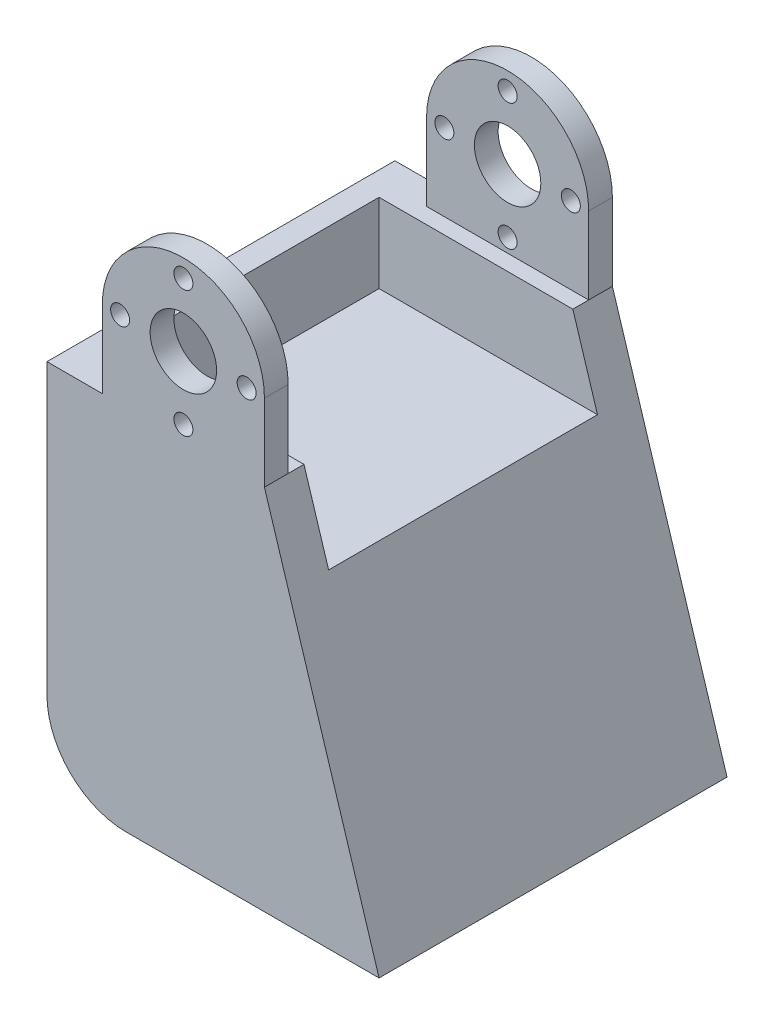
ISO-10303-21;
HEADER;
FILE_DESCRIPTION(('STEP AP214'),'2;1');
FILE_NAME('part.step','',(''),(''),'','','');
FILE_SCHEMA(('AUTOMOTIVE_DESIGN { 1 0 10303 214 1 1 1 1 }'));
ENDSEC;
DATA;
#1=APPLICATION_CONTEXT('core data for automotive mechanical design processes');
#2=APPLICATION_PROTOCOL_DEFINITION('international standard','automotive_design',2000,#1);
#3=PRODUCT_CONTEXT('',#1,'mechanical');
#4=PRODUCT('Part','Part','',(#3));
#5=PRODUCT_RELATED_PRODUCT_CATEGORY('part','',(#4));
#6=PRODUCT_DEFINITION_FORMATION('','',#4);
#7=PRODUCT_DEFINITION_CONTEXT('part definition',#1,'design');
#8=PRODUCT_DEFINITION('design','',#6,#7);
#9=PRODUCT_DEFINITION_SHAPE('','',#8);
#10=(LENGTH_UNIT() NAMED_UNIT(*) SI_UNIT(.MILLI.,.METRE.));
#11=(NAMED_UNIT(*) PLANE_ANGLE_UNIT() SI_UNIT($,.RADIAN.));
#12=(NAMED_UNIT(*) SI_UNIT($,.STERADIAN.) SOLID_ANGLE_UNIT());
#13=UNCERTAINTY_MEASURE_WITH_UNIT(LENGTH_MEASURE(1.E-05),#10,'distance_accuracy_value','');
#14=(GEOMETRIC_REPRESENTATION_CONTEXT(3) GLOBAL_UNCERTAINTY_ASSIGNED_CONTEXT((#13)) GLOBAL_UNIT_ASSIGNED_CONTEXT((#10,
#11,#12)) REPRESENTATION_CONTEXT('',''));
#15=CARTESIAN_POINT('',(0.,0.,0.));
#16=DIRECTION('',(0.,0.,1.));
#17=DIRECTION('',(1.,0.,0.));
#18=AXIS2_PLACEMENT_3D('',#15,#16,#17);
#19=CARTESIAN_POINT('',(10.25,0.,-22.));
#20=DIRECTION('',(-1.,0.,0.));
#21=DIRECTION('',(0.,0.,1.));
#22=AXIS2_PLACEMENT_3D('',#19,#20,#21);
#23=PLANE('',#22);
#24=DIRECTION('',(0.,0.,1.));
#25=VECTOR('',#24,1.);
#26=CARTESIAN_POINT('',(10.25,-9.75,-22.));
#27=LINE('',#26,#25);
#28=CARTESIAN_POINT('',(10.25,-9.75,19.));
#29=VERTEX_POINT('',#28);
#30=CARTESIAN_POINT('',(10.25,-9.75,22.));
#31=VERTEX_POINT('',#30);
#32=EDGE_CURVE('E270',#29,#31,#27,.T.);
#33=ORIENTED_EDGE('',*,*,#32,.F.);
#34=DIRECTION('',(0.,1.,0.));
#35=VECTOR('',#34,1.);
#36=CARTESIAN_POINT('',(10.25,10.25,19.));
#37=LINE('',#36,#35);
#38=CARTESIAN_POINT('',(10.25,0.,19.));
#39=VERTEX_POINT('',#38);
#40=EDGE_CURVE('E316',#29,#39,#37,.T.);
#41=ORIENTED_EDGE('',*,*,#40,.T.);
#42=DIRECTION('',(0.,0.,1.));
#43=VECTOR('',#42,1.);
#44=CARTESIAN_POINT('',(10.25,0.,-22.));
#45=LINE('',#44,#43);
#46=CARTESIAN_POINT('',(10.25,0.,22.));
#47=VERTEX_POINT('',#46);
#48=EDGE_CURVE('E444',#39,#47,#45,.T.);
#49=ORIENTED_EDGE('',*,*,#48,.T.);
#50=DIRECTION('',(0.,-1.,0.));
#51=VECTOR('',#50,1.);
#52=CARTESIAN_POINT('',(10.25,0.,22.));
#53=LINE('',#52,#51);
#54=EDGE_CURVE('E398',#47,#31,#53,.T.);
#55=ORIENTED_EDGE('',*,*,#54,.T.);
#56=EDGE_LOOP('',(#33,#41,#49,#55));
#57=FACE_BOUND('',#56,.T.);
#58=ADVANCED_FACE('F109',(#57),#23,.F.);
#59=CARTESIAN_POINT('',(10.25,-9.75,-22.));
#60=VERTEX_POINT('',#59);
#61=CARTESIAN_POINT('',(10.25,-9.75,-19.));
#62=VERTEX_POINT('',#61);
#63=EDGE_CURVE('E276',#60,#62,#27,.T.);
#64=ORIENTED_EDGE('',*,*,#63,.F.);
#65=DIRECTION('',(0.,-1.,0.));
#66=VECTOR('',#65,1.);
#67=CARTESIAN_POINT('',(10.25,0.,-22.));
#68=LINE('',#67,#66);
#69=CARTESIAN_POINT('',(10.25,0.,-22.));
#70=VERTEX_POINT('',#69);
#71=EDGE_CURVE('E430',#70,#60,#68,.T.);
#72=ORIENTED_EDGE('',*,*,#71,.F.);
#73=CARTESIAN_POINT('',(10.25,0.,-19.));
#74=VERTEX_POINT('',#73);
#75=EDGE_CURVE('E439',#70,#74,#45,.T.);
#76=ORIENTED_EDGE('',*,*,#75,.T.);
#77=DIRECTION('',(0.,-1.,0.));
#78=VECTOR('',#77,1.);
#79=CARTESIAN_POINT('',(10.25,10.25,-19.));
#80=LINE('',#79,#78);
#81=EDGE_CURVE('E312',#74,#62,#80,.T.);
#82=ORIENTED_EDGE('',*,*,#81,.T.);
#83=EDGE_LOOP('',(#64,#72,#76,#82));
#84=FACE_BOUND('',#83,.T.);
#85=ADVANCED_FACE('F552',(#84),#23,.F.);
#86=CARTESIAN_POINT('',(0.,0.,-22.));
#87=DIRECTION('',(0.,0.,1.));
#88=DIRECTION('',(1.,0.,0.));
#89=AXIS2_PLACEMENT_3D('',#86,#87,#88);
#90=PLANE('',#89);
#91=DIRECTION('',(1.,0.,0.));
#92=VECTOR('',#91,1.);
#93=CARTESIAN_POINT('',(0.,-56.25,-22.));
#94=LINE('',#93,#92);
#95=CARTESIAN_POINT('',(-7.25,-56.25,-22.));
#96=VERTEX_POINT('',#95);
#97=CARTESIAN_POINT('',(24.75,-56.25,-22.));
#98=VERTEX_POINT('',#97);
#99=EDGE_CURVE('E285',#96,#98,#94,.T.);
#100=ORIENTED_EDGE('',*,*,#99,.F.);
#101=CARTESIAN_POINT('',(-7.25,-46.25,-22.));
#102=DIRECTION('',(0.,0.,1.));
#103=DIRECTION('',(1.,0.,0.));
#104=AXIS2_PLACEMENT_3D('',#101,#102,#103);
#105=CIRCLE('',#104,10.);
#106=CARTESIAN_POINT('',(-17.25,-46.25,-22.));
#107=VERTEX_POINT('',#106);
#108=EDGE_CURVE('E12',#96,#107,#105,.F.);
#109=ORIENTED_EDGE('',*,*,#108,.T.);
#110=DIRECTION('',(0.,1.,0.));
#111=VECTOR('',#110,1.);
#112=CARTESIAN_POINT('',(-17.25,-75.25,-22.));
#113=LINE('',#112,#111);
#114=CARTESIAN_POINT('',(-17.25,-9.75,-22.));
#115=VERTEX_POINT('',#114);
#116=EDGE_CURVE('E305',#107,#115,#113,.T.);
#117=ORIENTED_EDGE('',*,*,#116,.T.);
#118=DIRECTION('',(-1.,0.,0.));
#119=VECTOR('',#118,1.);
#120=CARTESIAN_POINT('',(-10.25,-9.75,-22.));
#121=LINE('',#120,#119);
#122=CARTESIAN_POINT('',(-10.25,-9.75,-22.));
#123=VERTEX_POINT('',#122);
#124=EDGE_CURVE('E294',#123,#115,#121,.T.);
#125=ORIENTED_EDGE('',*,*,#124,.F.);
#126=DIRECTION('',(0.,-1.,0.));
#127=VECTOR('',#126,1.);
#128=CARTESIAN_POINT('',(-10.25,0.,-22.));
#129=LINE('',#128,#127);
#130=CARTESIAN_POINT('',(-10.25,0.,-22.));
#131=VERTEX_POINT('',#130);
#132=EDGE_CURVE('E426',#131,#123,#129,.T.);
#133=ORIENTED_EDGE('',*,*,#132,.F.);
#134=CARTESIAN_POINT('',(0.,0.,-22.));
#135=DIRECTION('',(0.,0.,1.));
#136=DIRECTION('',(1.,0.,0.));
#137=AXIS2_PLACEMENT_3D('',#134,#135,#136);
#138=CIRCLE('',#137,10.25);
#139=EDGE_CURVE('E422',#70,#131,#138,.T.);
#140=ORIENTED_EDGE('',*,*,#139,.F.);
#141=ORIENTED_EDGE('',*,*,#71,.T.);
#142=DIRECTION('',(0.297690442538056,-0.954662453656525,0.));
#143=VECTOR('',#142,1.);
#144=CARTESIAN_POINT('',(6.57075869336143,2.04894625922023,-22.));
#145=LINE('',#144,#143);
#146=EDGE_CURVE('E266',#60,#98,#145,.T.);
#147=ORIENTED_EDGE('',*,*,#146,.T.);
#148=EDGE_LOOP('',(#100,#109,#117,#125,#133,#140,#141,#147));
#149=FACE_BOUND('',#148,.T.);
#150=CARTESIAN_POINT('',(0.,-8.,-22.));
#151=DIRECTION('',(0.,0.,1.));
#152=DIRECTION('',(1.,0.,0.));
#153=AXIS2_PLACEMENT_3D('',#150,#151,#152);
#154=CIRCLE('',#153,1.2);
#155=CARTESIAN_POINT('',(1.19999999999994,-8.,-22.));
#156=VERTEX_POINT('',#155);
#157=EDGE_CURVE('E434',#156,#156,#154,.T.);
#158=ORIENTED_EDGE('',*,*,#157,.T.);
#159=EDGE_LOOP('',(#158));
#160=FACE_BOUND('',#159,.T.);
#161=CARTESIAN_POINT('',(0.,0.,-22.));
#162=DIRECTION('',(0.,0.,1.));
#163=DIRECTION('',(1.,0.,0.));
#164=AXIS2_PLACEMENT_3D('',#161,#162,#163);
#165=CIRCLE('',#164,4.2);
#166=CARTESIAN_POINT('',(4.2,0.,-22.));
#167=VERTEX_POINT('',#166);
#168=EDGE_CURVE('E418',#167,#167,#165,.T.);
#169=ORIENTED_EDGE('',*,*,#168,.T.);
#170=EDGE_LOOP('',(#169));
#171=FACE_BOUND('',#170,.T.);
#172=CARTESIAN_POINT('',(8.,0.,-22.));
#173=DIRECTION('',(0.,0.,1.));
#174=DIRECTION('',(1.,0.,0.));
#175=AXIS2_PLACEMENT_3D('',#172,#173,#174);
#176=CIRCLE('',#175,1.2);
#177=CARTESIAN_POINT('',(9.2,0.,-22.));
#178=VERTEX_POINT('',#177);
#179=EDGE_CURVE('E414',#178,#178,#176,.T.);
#180=ORIENTED_EDGE('',*,*,#179,.T.);
#181=EDGE_LOOP('',(#180));
#182=FACE_BOUND('',#181,.T.);
#183=CARTESIAN_POINT('',(0.,8.,-22.));
#184=DIRECTION('',(0.,0.,1.));
#185=DIRECTION('',(1.,0.,0.));
#186=AXIS2_PLACEMENT_3D('',#183,#184,#185);
#187=CIRCLE('',#186,1.2);
#188=CARTESIAN_POINT('',(1.2,8.,-22.));
#189=VERTEX_POINT('',#188);
#190=EDGE_CURVE('E410',#189,#189,#187,.T.);
#191=ORIENTED_EDGE('',*,*,#190,.T.);
#192=EDGE_LOOP('',(#191));
#193=FACE_BOUND('',#192,.T.);
#194=CARTESIAN_POINT('',(-8.,0.,-22.));
#195=DIRECTION('',(0.,0.,1.));
#196=DIRECTION('',(1.,0.,0.));
#197=AXIS2_PLACEMENT_3D('',#194,#195,#196);
#198=CIRCLE('',#197,1.2);
#199=CARTESIAN_POINT('',(-6.8,0.,-22.));
#200=VERTEX_POINT('',#199);
#201=EDGE_CURVE('E406',#200,#200,#198,.T.);
#202=ORIENTED_EDGE('',*,*,#201,.T.);
#203=EDGE_LOOP('',(#202));
#204=FACE_BOUND('',#203,.T.);
#205=ADVANCED_FACE('F527',(#149,#160,#171,#182,#193,#204),#90,.F.);
#206=CARTESIAN_POINT('',(0.,0.,22.));
#207=DIRECTION('',(0.,0.,1.));
#208=DIRECTION('',(1.,0.,0.));
#209=AXIS2_PLACEMENT_3D('',#206,#207,#208);
#210=PLANE('',#209);
#211=DIRECTION('',(0.,1.,0.));
#212=VECTOR('',#211,1.);
#213=CARTESIAN_POINT('',(-17.25,-75.25,22.));
#214=LINE('',#213,#212);
#215=CARTESIAN_POINT('',(-17.25,-46.25,22.));
#216=VERTEX_POINT('',#215);
#217=CARTESIAN_POINT('',(-17.25,-9.75,22.));
#218=VERTEX_POINT('',#217);
#219=EDGE_CURVE('E306',#216,#218,#214,.T.);
#220=ORIENTED_EDGE('',*,*,#219,.F.);
#221=CARTESIAN_POINT('',(-7.24999999999999,-46.25,22.));
#222=DIRECTION('',(0.,0.,1.));
#223=DIRECTION('',(1.,0.,0.));
#224=AXIS2_PLACEMENT_3D('',#221,#222,#223);
#225=CIRCLE('',#224,10.);
#226=CARTESIAN_POINT('',(-7.24999999999999,-56.25,22.));
#227=VERTEX_POINT('',#226);
#228=EDGE_CURVE('E132',#216,#227,#225,.T.);
#229=ORIENTED_EDGE('',*,*,#228,.T.);
#230=DIRECTION('',(1.,0.,0.));
#231=VECTOR('',#230,1.);
#232=CARTESIAN_POINT('',(0.,-56.25,22.));
#233=LINE('',#232,#231);
#234=CARTESIAN_POINT('',(24.75,-56.25,22.));
#235=VERTEX_POINT('',#234);
#236=EDGE_CURVE('E284',#227,#235,#233,.T.);
#237=ORIENTED_EDGE('',*,*,#236,.T.);
#238=DIRECTION('',(0.297690442538056,-0.954662453656525,0.));
#239=VECTOR('',#238,1.);
#240=CARTESIAN_POINT('',(6.57075869336143,2.04894625922023,22.));
#241=LINE('',#240,#239);
#242=EDGE_CURVE('E261',#31,#235,#241,.T.);
#243=ORIENTED_EDGE('',*,*,#242,.F.);
#244=ORIENTED_EDGE('',*,*,#54,.F.);
#245=CARTESIAN_POINT('',(0.,0.,22.));
#246=DIRECTION('',(0.,0.,1.));
#247=DIRECTION('',(1.,0.,0.));
#248=AXIS2_PLACEMENT_3D('',#245,#246,#247);
#249=CIRCLE('',#248,10.25);
#250=CARTESIAN_POINT('',(-10.25,0.,22.));
#251=VERTEX_POINT('',#250);
#252=EDGE_CURVE('E390',#47,#251,#249,.T.);
#253=ORIENTED_EDGE('',*,*,#252,.T.);
#254=DIRECTION('',(0.,-1.,0.));
#255=VECTOR('',#254,1.);
#256=CARTESIAN_POINT('',(-10.25,0.,22.));
#257=LINE('',#256,#255);
#258=CARTESIAN_POINT('',(-10.25,-9.75,22.));
#259=VERTEX_POINT('',#258);
#260=EDGE_CURVE('E394',#251,#259,#257,.T.);
#261=ORIENTED_EDGE('',*,*,#260,.T.);
#262=DIRECTION('',(1.,0.,0.));
#263=VECTOR('',#262,1.);
#264=CARTESIAN_POINT('',(-10.25,-9.75,22.));
#265=LINE('',#264,#263);
#266=EDGE_CURVE('E302',#218,#259,#265,.T.);
#267=ORIENTED_EDGE('',*,*,#266,.F.);
#268=EDGE_LOOP('',(#220,#229,#237,#243,#244,#253,#261,#267));
#269=FACE_BOUND('',#268,.T.);
#270=CARTESIAN_POINT('',(-8.,0.,22.));
#271=DIRECTION('',(0.,0.,1.));
#272=DIRECTION('',(1.,0.,0.));
#273=AXIS2_PLACEMENT_3D('',#270,#271,#272);
#274=CIRCLE('',#273,1.2);
#275=CARTESIAN_POINT('',(-6.8,0.,22.));
#276=VERTEX_POINT('',#275);
#277=EDGE_CURVE('E374',#276,#276,#274,.T.);
#278=ORIENTED_EDGE('',*,*,#277,.F.);
#279=EDGE_LOOP('',(#278));
#280=FACE_BOUND('',#279,.T.);
#281=CARTESIAN_POINT('',(0.,8.,22.));
#282=DIRECTION('',(0.,0.,1.));
#283=DIRECTION('',(1.,0.,0.));
#284=AXIS2_PLACEMENT_3D('',#281,#282,#283);
#285=CIRCLE('',#284,1.2);
#286=CARTESIAN_POINT('',(1.2,8.,22.));
#287=VERTEX_POINT('',#286);
#288=EDGE_CURVE('E378',#287,#287,#285,.T.);
#289=ORIENTED_EDGE('',*,*,#288,.F.);
#290=EDGE_LOOP('',(#289));
#291=FACE_BOUND('',#290,.T.);
#292=CARTESIAN_POINT('',(8.,0.,22.));
#293=DIRECTION('',(0.,0.,1.));
#294=DIRECTION('',(1.,0.,0.));
#295=AXIS2_PLACEMENT_3D('',#292,#293,#294);
#296=CIRCLE('',#295,1.2);
#297=CARTESIAN_POINT('',(9.2,0.,22.));
#298=VERTEX_POINT('',#297);
#299=EDGE_CURVE('E382',#298,#298,#296,.T.);
#300=ORIENTED_EDGE('',*,*,#299,.F.);
#301=EDGE_LOOP('',(#300));
#302=FACE_BOUND('',#301,.T.);
#303=CARTESIAN_POINT('',(0.,0.,22.));
#304=DIRECTION('',(0.,0.,1.));
#305=DIRECTION('',(1.,0.,0.));
#306=AXIS2_PLACEMENT_3D('',#303,#304,#305);
#307=CIRCLE('',#306,4.2);
#308=CARTESIAN_POINT('',(4.2,0.,22.));
#309=VERTEX_POINT('',#308);
#310=EDGE_CURVE('E386',#309,#309,#307,.T.);
#311=ORIENTED_EDGE('',*,*,#310,.F.);
#312=EDGE_LOOP('',(#311));
#313=FACE_BOUND('',#312,.T.);
#314=CARTESIAN_POINT('',(0.,-8.,22.));
#315=DIRECTION('',(0.,0.,1.));
#316=DIRECTION('',(1.,0.,0.));
#317=AXIS2_PLACEMENT_3D('',#314,#315,#316);
#318=CIRCLE('',#317,1.2);
#319=CARTESIAN_POINT('',(1.19999999999994,-8.,22.));
#320=VERTEX_POINT('',#319);
#321=EDGE_CURVE('E402',#320,#320,#318,.T.);
#322=ORIENTED_EDGE('',*,*,#321,.F.);
#323=EDGE_LOOP('',(#322));
#324=FACE_BOUND('',#323,.T.);
#325=ADVANCED_FACE('F483',(#269,#280,#291,#302,#313,#324),#210,.T.);
#326=CARTESIAN_POINT('',(-17.25,-75.25,-22.));
#327=DIRECTION('',(-1.,0.,0.));
#328=DIRECTION('',(0.,0.,1.));
#329=AXIS2_PLACEMENT_3D('',#326,#327,#328);
#330=PLANE('',#329);
#331=ORIENTED_EDGE('',*,*,#116,.F.);
#332=DIRECTION('',(0.,0.,1.));
#333=VECTOR('',#332,1.);
#334=CARTESIAN_POINT('',(-17.25,-46.25,-22.));
#335=LINE('',#334,#333);
#336=EDGE_CURVE('E463',#107,#216,#335,.T.);
#337=ORIENTED_EDGE('',*,*,#336,.T.);
#338=ORIENTED_EDGE('',*,*,#219,.T.);
#339=DIRECTION('',(0.,0.,1.));
#340=VECTOR('',#339,1.);
#341=CARTESIAN_POINT('',(-17.25,-9.75,-22.));
#342=LINE('',#341,#340);
#343=EDGE_CURVE('E298',#115,#218,#342,.T.);
#344=ORIENTED_EDGE('',*,*,#343,.F.);
#345=EDGE_LOOP('',(#331,#337,#338,#344));
#346=FACE_BOUND('',#345,.T.);
#347=ADVANCED_FACE('F526',(#346),#330,.T.);
#348=CARTESIAN_POINT('',(-10.25,0.,-22.));
#349=DIRECTION('',(-1.,0.,0.));
#350=DIRECTION('',(0.,0.,1.));
#351=AXIS2_PLACEMENT_3D('',#348,#349,#350);
#352=PLANE('',#351);
#353=ORIENTED_EDGE('',*,*,#132,.T.);
#354=DIRECTION('',(0.,0.,-1.));
#355=VECTOR('',#354,1.);
#356=CARTESIAN_POINT('',(-10.25,-9.75,-22.));
#357=LINE('',#356,#355);
#358=CARTESIAN_POINT('',(-10.25,-9.75,-19.));
#359=VERTEX_POINT('',#358);
#360=EDGE_CURVE('E288',#359,#123,#357,.T.);
#361=ORIENTED_EDGE('',*,*,#360,.F.);
#362=DIRECTION('',(0.,-1.,0.));
#363=VECTOR('',#362,1.);
#364=CARTESIAN_POINT('',(-10.25,10.25,-19.));
#365=LINE('',#364,#363);
#366=CARTESIAN_POINT('',(-10.25,0.,-19.));
#367=VERTEX_POINT('',#366);
#368=EDGE_CURVE('E309',#367,#359,#365,.T.);
#369=ORIENTED_EDGE('',*,*,#368,.F.);
#370=DIRECTION('',(0.,0.,1.));
#371=VECTOR('',#370,1.);
#372=CARTESIAN_POINT('',(-10.25,0.,-22.));
#373=LINE('',#372,#371);
#374=EDGE_CURVE('E445',#131,#367,#373,.T.);
#375=ORIENTED_EDGE('',*,*,#374,.F.);
#376=EDGE_LOOP('',(#353,#361,#369,#375));
#377=FACE_BOUND('',#376,.T.);
#378=ADVANCED_FACE('F559',(#377),#352,.T.);
#379=DIRECTION('',(0.,1.,0.));
#380=VECTOR('',#379,1.);
#381=CARTESIAN_POINT('',(-10.25,10.25,19.));
#382=LINE('',#381,#380);
#383=CARTESIAN_POINT('',(-10.25,-9.75,19.));
#384=VERTEX_POINT('',#383);
#385=CARTESIAN_POINT('',(-10.25,0.,19.));
#386=VERTEX_POINT('',#385);
#387=EDGE_CURVE('E317',#384,#386,#382,.T.);
#388=ORIENTED_EDGE('',*,*,#387,.F.);
#389=EDGE_CURVE('E291',#259,#384,#357,.T.);
#390=ORIENTED_EDGE('',*,*,#389,.F.);
#391=ORIENTED_EDGE('',*,*,#260,.F.);
#392=EDGE_CURVE('E438',#386,#251,#373,.T.);
#393=ORIENTED_EDGE('',*,*,#392,.F.);
#394=EDGE_LOOP('',(#388,#390,#391,#393));
#395=FACE_BOUND('',#394,.T.);
#396=ADVANCED_FACE('F496',(#395),#352,.T.);
#397=CARTESIAN_POINT('',(0.,0.,-22.));
#398=DIRECTION('',(0.,0.,1.));
#399=DIRECTION('',(1.,0.,0.));
#400=AXIS2_PLACEMENT_3D('',#397,#398,#399);
#401=CYLINDRICAL_SURFACE('',#400,10.25);
#402=CARTESIAN_POINT('',(0.,0.,-19.));
#403=DIRECTION('',(0.,0.,-1.));
#404=DIRECTION('',(-1.,0.,0.));
#405=AXIS2_PLACEMENT_3D('',#402,#403,#404);
#406=CIRCLE('',#405,10.25);
#407=EDGE_CURVE('E371',#74,#367,#406,.F.);
#408=ORIENTED_EDGE('',*,*,#407,.F.);
#409=ORIENTED_EDGE('',*,*,#75,.F.);
#410=ORIENTED_EDGE('',*,*,#139,.T.);
#411=ORIENTED_EDGE('',*,*,#374,.T.);
#412=EDGE_LOOP('',(#408,#409,#410,#411));
#413=FACE_BOUND('',#412,.T.);
#414=ADVANCED_FACE('F563',(#413),#401,.T.);
#415=CARTESIAN_POINT('',(0.,0.,-22.));
#416=DIRECTION('',(0.,0.,1.));
#417=DIRECTION('',(1.,0.,0.));
#418=AXIS2_PLACEMENT_3D('',#415,#416,#417);
#419=CYLINDRICAL_SURFACE('',#418,4.2);
#420=CARTESIAN_POINT('',(0.,0.,-19.));
#421=DIRECTION('',(0.,0.,-1.));
#422=DIRECTION('',(-1.,0.,0.));
#423=AXIS2_PLACEMENT_3D('',#420,#421,#422);
#424=CIRCLE('',#423,4.2);
#425=CARTESIAN_POINT('',(-4.2,0.,-19.));
#426=VERTEX_POINT('',#425);
#427=EDGE_CURVE('E367',#426,#426,#424,.F.);
#428=ORIENTED_EDGE('',*,*,#427,.T.);
#429=EDGE_LOOP('',(#428));
#430=FACE_BOUND('',#429,.T.);
#431=ORIENTED_EDGE('',*,*,#168,.F.);
#432=EDGE_LOOP('',(#431));
#433=FACE_BOUND('',#432,.T.);
#434=ADVANCED_FACE('F521',(#430,#433),#419,.F.);
#435=CARTESIAN_POINT('',(8.,0.,-22.));
#436=DIRECTION('',(0.,0.,1.));
#437=DIRECTION('',(1.,0.,0.));
#438=AXIS2_PLACEMENT_3D('',#435,#436,#437);
#439=CYLINDRICAL_SURFACE('',#438,1.2);
#440=CARTESIAN_POINT('',(8.,0.,-19.));
#441=DIRECTION('',(0.,0.,-1.));
#442=DIRECTION('',(-1.,0.,0.));
#443=AXIS2_PLACEMENT_3D('',#440,#441,#442);
#444=CIRCLE('',#443,1.2);
#445=CARTESIAN_POINT('',(6.8,0.,-19.));
#446=VERTEX_POINT('',#445);
#447=EDGE_CURVE('E363',#446,#446,#444,.F.);
#448=ORIENTED_EDGE('',*,*,#447,.T.);
#449=EDGE_LOOP('',(#448));
#450=FACE_BOUND('',#449,.T.);
#451=ORIENTED_EDGE('',*,*,#179,.F.);
#452=EDGE_LOOP('',(#451));
#453=FACE_BOUND('',#452,.T.);
#454=ADVANCED_FACE('F568',(#450,#453),#439,.F.);
#455=CARTESIAN_POINT('',(0.,8.,-22.));
#456=DIRECTION('',(0.,0.,1.));
#457=DIRECTION('',(1.,0.,0.));
#458=AXIS2_PLACEMENT_3D('',#455,#456,#457);
#459=CYLINDRICAL_SURFACE('',#458,1.2);
#460=CARTESIAN_POINT('',(0.,8.,-19.));
#461=DIRECTION('',(0.,0.,-1.));
#462=DIRECTION('',(-1.,0.,0.));
#463=AXIS2_PLACEMENT_3D('',#460,#461,#462);
#464=CIRCLE('',#463,1.2);
#465=CARTESIAN_POINT('',(-1.2,8.,-19.));
#466=VERTEX_POINT('',#465);
#467=EDGE_CURVE('E359',#466,#466,#464,.F.);
#468=ORIENTED_EDGE('',*,*,#467,.T.);
#469=EDGE_LOOP('',(#468));
#470=FACE_BOUND('',#469,.T.);
#471=ORIENTED_EDGE('',*,*,#190,.F.);
#472=EDGE_LOOP('',(#471));
#473=FACE_BOUND('',#472,.T.);
#474=ADVANCED_FACE('F571',(#470,#473),#459,.F.);
#475=CARTESIAN_POINT('',(-8.,0.,-22.));
#476=DIRECTION('',(0.,0.,1.));
#477=DIRECTION('',(1.,0.,0.));
#478=AXIS2_PLACEMENT_3D('',#475,#476,#477);
#479=CYLINDRICAL_SURFACE('',#478,1.2);
#480=CARTESIAN_POINT('',(-8.,0.,-19.));
#481=DIRECTION('',(0.,0.,-1.));
#482=DIRECTION('',(-1.,0.,0.));
#483=AXIS2_PLACEMENT_3D('',#480,#481,#482);
#484=CIRCLE('',#483,1.2);
#485=CARTESIAN_POINT('',(-9.2,0.,-19.));
#486=VERTEX_POINT('',#485);
#487=EDGE_CURVE('E355',#486,#486,#484,.F.);
#488=ORIENTED_EDGE('',*,*,#487,.T.);
#489=EDGE_LOOP('',(#488));
#490=FACE_BOUND('',#489,.T.);
#491=ORIENTED_EDGE('',*,*,#201,.F.);
#492=EDGE_LOOP('',(#491));
#493=FACE_BOUND('',#492,.T.);
#494=ADVANCED_FACE('F546',(#490,#493),#479,.F.);
#495=CARTESIAN_POINT('',(0.,-8.,-22.));
#496=DIRECTION('',(0.,0.,1.));
#497=DIRECTION('',(1.,0.,0.));
#498=AXIS2_PLACEMENT_3D('',#495,#496,#497);
#499=CYLINDRICAL_SURFACE('',#498,1.2);
#500=CARTESIAN_POINT('',(0.,-8.,-19.));
#501=DIRECTION('',(0.,0.,-1.));
#502=DIRECTION('',(-1.,0.,0.));
#503=AXIS2_PLACEMENT_3D('',#500,#501,#502);
#504=CIRCLE('',#503,1.2);
#505=CARTESIAN_POINT('',(-1.20000000000006,-8.,-19.));
#506=VERTEX_POINT('',#505);
#507=EDGE_CURVE('E354',#506,#506,#504,.F.);
#508=ORIENTED_EDGE('',*,*,#507,.T.);
#509=EDGE_LOOP('',(#508));
#510=FACE_BOUND('',#509,.T.);
#511=ORIENTED_EDGE('',*,*,#157,.F.);
#512=EDGE_LOOP('',(#511));
#513=FACE_BOUND('',#512,.T.);
#514=ADVANCED_FACE('F536',(#510,#513),#499,.F.);
#515=CARTESIAN_POINT('',(0.,0.,19.));
#516=DIRECTION('',(0.,0.,1.));
#517=DIRECTION('',(0.,-1.,0.));
#518=AXIS2_PLACEMENT_3D('',#515,#516,#517);
#519=CIRCLE('',#518,10.25);
#520=EDGE_CURVE('E351',#386,#39,#519,.F.);
#521=ORIENTED_EDGE('',*,*,#520,.F.);
#522=ORIENTED_EDGE('',*,*,#392,.T.);
#523=ORIENTED_EDGE('',*,*,#252,.F.);
#524=ORIENTED_EDGE('',*,*,#48,.F.);
#525=EDGE_LOOP('',(#521,#522,#523,#524));
#526=FACE_BOUND('',#525,.T.);
#527=ADVANCED_FACE('F489',(#526),#401,.T.);
#528=CARTESIAN_POINT('',(0.,0.,19.));
#529=DIRECTION('',(0.,0.,1.));
#530=DIRECTION('',(0.,-1.,0.));
#531=AXIS2_PLACEMENT_3D('',#528,#529,#530);
#532=CIRCLE('',#531,4.2);
#533=CARTESIAN_POINT('',(0.,-4.2,19.));
#534=VERTEX_POINT('',#533);
#535=EDGE_CURVE('E347',#534,#534,#532,.F.);
#536=ORIENTED_EDGE('',*,*,#535,.T.);
#537=EDGE_LOOP('',(#536));
#538=FACE_BOUND('',#537,.T.);
#539=ORIENTED_EDGE('',*,*,#310,.T.);
#540=EDGE_LOOP('',(#539));
#541=FACE_BOUND('',#540,.T.);
#542=ADVANCED_FACE('F516',(#538,#541),#419,.F.);
#543=CARTESIAN_POINT('',(8.,0.,19.));
#544=DIRECTION('',(0.,0.,1.));
#545=DIRECTION('',(0.,-1.,0.));
#546=AXIS2_PLACEMENT_3D('',#543,#544,#545);
#547=CIRCLE('',#546,1.2);
#548=CARTESIAN_POINT('',(8.,-1.20000000000003,19.));
#549=VERTEX_POINT('',#548);
#550=EDGE_CURVE('E343',#549,#549,#547,.F.);
#551=ORIENTED_EDGE('',*,*,#550,.T.);
#552=EDGE_LOOP('',(#551));
#553=FACE_BOUND('',#552,.T.);
#554=ORIENTED_EDGE('',*,*,#299,.T.);
#555=EDGE_LOOP('',(#554));
#556=FACE_BOUND('',#555,.T.);
#557=ADVANCED_FACE('F519',(#553,#556),#439,.F.);
#558=CARTESIAN_POINT('',(0.,8.,19.));
#559=DIRECTION('',(0.,0.,1.));
#560=DIRECTION('',(0.,-1.,0.));
#561=AXIS2_PLACEMENT_3D('',#558,#559,#560);
#562=CIRCLE('',#561,1.2);
#563=CARTESIAN_POINT('',(0.,6.8,19.));
#564=VERTEX_POINT('',#563);
#565=EDGE_CURVE('E339',#564,#564,#562,.F.);
#566=ORIENTED_EDGE('',*,*,#565,.T.);
#567=EDGE_LOOP('',(#566));
#568=FACE_BOUND('',#567,.T.);
#569=ORIENTED_EDGE('',*,*,#288,.T.);
#570=EDGE_LOOP('',(#569));
#571=FACE_BOUND('',#570,.T.);
#572=ADVANCED_FACE('F544',(#568,#571),#459,.F.);
#573=CARTESIAN_POINT('',(-8.,0.,19.));
#574=DIRECTION('',(0.,0.,1.));
#575=DIRECTION('',(0.,-1.,0.));
#576=AXIS2_PLACEMENT_3D('',#573,#574,#575);
#577=CIRCLE('',#576,1.2);
#578=CARTESIAN_POINT('',(-8.,-1.19999999999992,19.));
#579=VERTEX_POINT('',#578);
#580=EDGE_CURVE('E335',#579,#579,#577,.F.);
#581=ORIENTED_EDGE('',*,*,#580,.T.);
#582=EDGE_LOOP('',(#581));
#583=FACE_BOUND('',#582,.T.);
#584=ORIENTED_EDGE('',*,*,#277,.T.);
#585=EDGE_LOOP('',(#584));
#586=FACE_BOUND('',#585,.T.);
#587=ADVANCED_FACE('F533',(#583,#586),#479,.F.);
#588=CARTESIAN_POINT('',(0.,-8.,19.));
#589=DIRECTION('',(0.,0.,1.));
#590=DIRECTION('',(0.,-1.,0.));
#591=AXIS2_PLACEMENT_3D('',#588,#589,#590);
#592=CIRCLE('',#591,1.2);
#593=CARTESIAN_POINT('',(0.,-9.2,19.));
#594=VERTEX_POINT('',#593);
#595=EDGE_CURVE('E331',#594,#594,#592,.F.);
#596=ORIENTED_EDGE('',*,*,#595,.T.);
#597=EDGE_LOOP('',(#596));
#598=FACE_BOUND('',#597,.T.);
#599=ORIENTED_EDGE('',*,*,#321,.T.);
#600=EDGE_LOOP('',(#599));
#601=FACE_BOUND('',#600,.T.);
#602=ADVANCED_FACE('F531',(#598,#601),#499,.F.);
#603=CARTESIAN_POINT('',(10.25,10.25,-19.));
#604=DIRECTION('',(0.,0.,-1.));
#605=DIRECTION('',(-1.,0.,0.));
#606=AXIS2_PLACEMENT_3D('',#603,#604,#605);
#607=PLANE('',#606);
#608=ORIENTED_EDGE('',*,*,#407,.T.);
#609=ORIENTED_EDGE('',*,*,#368,.T.);
#610=DIRECTION('',(-1.,0.,0.));
#611=VECTOR('',#610,1.);
#612=CARTESIAN_POINT('',(10.25,-9.75,-19.));
#613=LINE('',#612,#611);
#614=EDGE_CURVE('E321',#62,#359,#613,.T.);
#615=ORIENTED_EDGE('',*,*,#614,.F.);
#616=ORIENTED_EDGE('',*,*,#81,.F.);
#617=EDGE_LOOP('',(#608,#609,#615,#616));
#618=FACE_BOUND('',#617,.T.);
#619=ORIENTED_EDGE('',*,*,#447,.F.);
#620=EDGE_LOOP('',(#619));
#621=FACE_BOUND('',#620,.T.);
#622=ORIENTED_EDGE('',*,*,#487,.F.);
#623=EDGE_LOOP('',(#622));
#624=FACE_BOUND('',#623,.T.);
#625=ORIENTED_EDGE('',*,*,#507,.F.);
#626=EDGE_LOOP('',(#625));
#627=FACE_BOUND('',#626,.T.);
#628=ORIENTED_EDGE('',*,*,#467,.F.);
#629=EDGE_LOOP('',(#628));
#630=FACE_BOUND('',#629,.T.);
#631=ORIENTED_EDGE('',*,*,#427,.F.);
#632=EDGE_LOOP('',(#631));
#633=FACE_BOUND('',#632,.T.);
#634=ADVANCED_FACE('F504',(#618,#621,#624,#627,#630,#633),#607,.F.);
#635=CARTESIAN_POINT('',(10.25,10.25,19.));
#636=DIRECTION('',(0.,0.,1.));
#637=DIRECTION('',(0.,-1.,0.));
#638=AXIS2_PLACEMENT_3D('',#635,#636,#637);
#639=PLANE('',#638);
#640=ORIENTED_EDGE('',*,*,#520,.T.);
#641=ORIENTED_EDGE('',*,*,#40,.F.);
#642=DIRECTION('',(-1.,0.,0.));
#643=VECTOR('',#642,1.);
#644=CARTESIAN_POINT('',(10.25,-9.75,19.));
#645=LINE('',#644,#643);
#646=EDGE_CURVE('E327',#29,#384,#645,.T.);
#647=ORIENTED_EDGE('',*,*,#646,.T.);
#648=ORIENTED_EDGE('',*,*,#387,.T.);
#649=EDGE_LOOP('',(#640,#641,#647,#648));
#650=FACE_BOUND('',#649,.T.);
#651=ORIENTED_EDGE('',*,*,#550,.F.);
#652=EDGE_LOOP('',(#651));
#653=FACE_BOUND('',#652,.T.);
#654=ORIENTED_EDGE('',*,*,#580,.F.);
#655=EDGE_LOOP('',(#654));
#656=FACE_BOUND('',#655,.T.);
#657=ORIENTED_EDGE('',*,*,#595,.F.);
#658=EDGE_LOOP('',(#657));
#659=FACE_BOUND('',#658,.T.);
#660=ORIENTED_EDGE('',*,*,#565,.F.);
#661=EDGE_LOOP('',(#660));
#662=FACE_BOUND('',#661,.T.);
#663=ORIENTED_EDGE('',*,*,#535,.F.);
#664=EDGE_LOOP('',(#663));
#665=FACE_BOUND('',#664,.T.);
#666=ADVANCED_FACE('F501',(#650,#653,#656,#659,#662,#665),#639,.F.);
#667=CARTESIAN_POINT('',(10.25,-9.75,-19.));
#668=DIRECTION('',(0.,-1.,0.));
#669=DIRECTION('',(0.,0.,-1.));
#670=AXIS2_PLACEMENT_3D('',#667,#668,#669);
#671=PLANE('',#670);
#672=DIRECTION('',(0.,0.,1.));
#673=VECTOR('',#672,1.);
#674=CARTESIAN_POINT('',(-14.25,-9.75,-17.));
#675=LINE('',#674,#673);
#676=CARTESIAN_POINT('',(-14.25,-9.75,-17.));
#677=VERTEX_POINT('',#676);
#678=CARTESIAN_POINT('',(-14.25,-9.75,17.));
#679=VERTEX_POINT('',#678);
#680=EDGE_CURVE('E228',#677,#679,#675,.T.);
#681=ORIENTED_EDGE('',*,*,#680,.F.);
#682=DIRECTION('',(-1.,0.,0.));
#683=VECTOR('',#682,1.);
#684=CARTESIAN_POINT('',(-14.25,-9.75,-17.));
#685=LINE('',#684,#683);
#686=CARTESIAN_POINT('',(10.25,-9.75,-17.));
#687=VERTEX_POINT('',#686);
#688=EDGE_CURVE('E248',#687,#677,#685,.T.);
#689=ORIENTED_EDGE('',*,*,#688,.F.);
#690=DIRECTION('',(0.,0.,-1.));
#691=VECTOR('',#690,1.);
#692=CARTESIAN_POINT('',(10.25,-9.75,22.));
#693=LINE('',#692,#691);
#694=EDGE_CURVE('E275',#687,#62,#693,.T.);
#695=ORIENTED_EDGE('',*,*,#694,.T.);
#696=ORIENTED_EDGE('',*,*,#614,.T.);
#697=ORIENTED_EDGE('',*,*,#360,.T.);
#698=ORIENTED_EDGE('',*,*,#124,.T.);
#699=ORIENTED_EDGE('',*,*,#343,.T.);
#700=ORIENTED_EDGE('',*,*,#266,.T.);
#701=ORIENTED_EDGE('',*,*,#389,.T.);
#702=ORIENTED_EDGE('',*,*,#646,.F.);
#703=CARTESIAN_POINT('',(10.25,-9.75,17.));
#704=VERTEX_POINT('',#703);
#705=EDGE_CURVE('E280',#29,#704,#693,.T.);
#706=ORIENTED_EDGE('',*,*,#705,.T.);
#707=DIRECTION('',(1.,0.,0.));
#708=VECTOR('',#707,1.);
#709=CARTESIAN_POINT('',(-14.25,-9.75,17.));
#710=LINE('',#709,#708);
#711=EDGE_CURVE('E251',#679,#704,#710,.T.);
#712=ORIENTED_EDGE('',*,*,#711,.F.);
#713=EDGE_LOOP('',(#681,#689,#695,#696,#697,#698,#699,#700,#701,#702,#706,#712));
#714=FACE_BOUND('',#713,.T.);
#715=ADVANCED_FACE('F499',(#714),#671,.F.);
#716=CARTESIAN_POINT('',(0.,-56.25,-22.));
#717=DIRECTION('',(0.,-1.,0.));
#718=DIRECTION('',(0.,0.,-1.));
#719=AXIS2_PLACEMENT_3D('',#716,#717,#718);
#720=PLANE('',#719);
#721=ORIENTED_EDGE('',*,*,#236,.F.);
#722=DIRECTION('',(0.,0.,1.));
#723=VECTOR('',#722,1.);
#724=CARTESIAN_POINT('',(-7.25,-56.25,-22.));
#725=LINE('',#724,#723);
#726=EDGE_CURVE('E118',#227,#96,#725,.F.);
#727=ORIENTED_EDGE('',*,*,#726,.T.);
#728=ORIENTED_EDGE('',*,*,#99,.T.);
#729=DIRECTION('',(0.,0.,1.));
#730=VECTOR('',#729,1.);
#731=CARTESIAN_POINT('',(24.75,-56.25,-22.));
#732=LINE('',#731,#730);
#733=EDGE_CURVE('E271',#98,#235,#732,.T.);
#734=ORIENTED_EDGE('',*,*,#733,.T.);
#735=EDGE_LOOP('',(#721,#727,#728,#734));
#736=FACE_BOUND('',#735,.T.);
#737=ADVANCED_FACE('F598',(#736),#720,.T.);
#738=CARTESIAN_POINT('',(6.57075869336143,2.04894625922023,-22.));
#739=DIRECTION('',(-0.954662453656525,-0.297690442538056,0.));
#740=DIRECTION('',(0.297690442538056,-0.954662453656525,0.));
#741=AXIS2_PLACEMENT_3D('',#738,#739,#740);
#742=PLANE('',#741);
#743=ORIENTED_EDGE('',*,*,#694,.F.);
#744=DIRECTION('',(0.297690442538056,-0.954662453656525,0.));
#745=VECTOR('',#744,1.);
#746=CARTESIAN_POINT('',(6.57075869336143,2.04894625922023,-17.));
#747=LINE('',#746,#745);
#748=CARTESIAN_POINT('',(13.3682795698925,-19.75,-17.));
#749=VERTEX_POINT('',#748);
#750=EDGE_CURVE('E459',#687,#749,#747,.T.);
#751=ORIENTED_EDGE('',*,*,#750,.T.);
#752=DIRECTION('',(0.,0.,-1.));
#753=VECTOR('',#752,1.);
#754=CARTESIAN_POINT('',(13.3682795698925,-19.75,-22.));
#755=LINE('',#754,#753);
#756=CARTESIAN_POINT('',(13.3682795698925,-19.75,17.));
#757=VERTEX_POINT('',#756);
#758=EDGE_CURVE('E443',#757,#749,#755,.T.);
#759=ORIENTED_EDGE('',*,*,#758,.F.);
#760=DIRECTION('',(-0.297690442538056,0.954662453656525,0.));
#761=VECTOR('',#760,1.);
#762=CARTESIAN_POINT('',(6.57075869336143,2.04894625922023,17.));
#763=LINE('',#762,#761);
#764=EDGE_CURVE('E239',#757,#704,#763,.T.);
#765=ORIENTED_EDGE('',*,*,#764,.T.);
#766=ORIENTED_EDGE('',*,*,#705,.F.);
#767=ORIENTED_EDGE('',*,*,#32,.T.);
#768=ORIENTED_EDGE('',*,*,#242,.T.);
#769=ORIENTED_EDGE('',*,*,#733,.F.);
#770=ORIENTED_EDGE('',*,*,#146,.F.);
#771=ORIENTED_EDGE('',*,*,#63,.T.);
#772=EDGE_LOOP('',(#743,#751,#759,#765,#766,#767,#768,#769,#770,#771));
#773=FACE_BOUND('',#772,.T.);
#774=ADVANCED_FACE('F478',(#773),#742,.F.);
#775=CARTESIAN_POINT('',(-14.25,-19.75,-17.));
#776=DIRECTION('',(0.,0.,-1.));
#777=DIRECTION('',(-1.,0.,0.));
#778=AXIS2_PLACEMENT_3D('',#775,#776,#777);
#779=PLANE('',#778);
#780=ORIENTED_EDGE('',*,*,#688,.T.);
#781=DIRECTION('',(0.,1.,0.));
#782=VECTOR('',#781,1.);
#783=CARTESIAN_POINT('',(-14.25,-19.75,-17.));
#784=LINE('',#783,#782);
#785=CARTESIAN_POINT('',(-14.25,-19.75,-17.));
#786=VERTEX_POINT('',#785);
#787=EDGE_CURVE('E232',#786,#677,#784,.T.);
#788=ORIENTED_EDGE('',*,*,#787,.F.);
#789=DIRECTION('',(-1.,0.,0.));
#790=VECTOR('',#789,1.);
#791=CARTESIAN_POINT('',(-14.25,-19.75,-17.));
#792=LINE('',#791,#790);
#793=EDGE_CURVE('E233',#749,#786,#792,.T.);
#794=ORIENTED_EDGE('',*,*,#793,.F.);
#795=ORIENTED_EDGE('',*,*,#750,.F.);
#796=EDGE_LOOP('',(#780,#788,#794,#795));
#797=FACE_BOUND('',#796,.T.);
#798=ADVANCED_FACE('F607',(#797),#779,.F.);
#799=CARTESIAN_POINT('',(-14.25,-19.75,17.));
#800=DIRECTION('',(0.,0.,1.));
#801=DIRECTION('',(1.,0.,0.));
#802=AXIS2_PLACEMENT_3D('',#799,#800,#801);
#803=PLANE('',#802);
#804=DIRECTION('',(1.,0.,0.));
#805=VECTOR('',#804,1.);
#806=CARTESIAN_POINT('',(-14.25,-19.75,17.));
#807=LINE('',#806,#805);
#808=CARTESIAN_POINT('',(-14.25,-19.75,17.));
#809=VERTEX_POINT('',#808);
#810=EDGE_CURVE('E236',#809,#757,#807,.T.);
#811=ORIENTED_EDGE('',*,*,#810,.F.);
#812=DIRECTION('',(0.,1.,0.));
#813=VECTOR('',#812,1.);
#814=CARTESIAN_POINT('',(-14.25,-19.75,17.));
#815=LINE('',#814,#813);
#816=EDGE_CURVE('E221',#809,#679,#815,.T.);
#817=ORIENTED_EDGE('',*,*,#816,.T.);
#818=ORIENTED_EDGE('',*,*,#711,.T.);
#819=ORIENTED_EDGE('',*,*,#764,.F.);
#820=EDGE_LOOP('',(#811,#817,#818,#819));
#821=FACE_BOUND('',#820,.T.);
#822=ADVANCED_FACE('F237',(#821),#803,.F.);
#823=CARTESIAN_POINT('',(0.,-19.75,0.));
#824=DIRECTION('',(0.,1.,0.));
#825=DIRECTION('',(0.,0.,1.));
#826=AXIS2_PLACEMENT_3D('',#823,#824,#825);
#827=PLANE('',#826);
#828=ORIENTED_EDGE('',*,*,#758,.T.);
#829=ORIENTED_EDGE('',*,*,#793,.T.);
#830=DIRECTION('',(0.,0.,1.));
#831=VECTOR('',#830,1.);
#832=CARTESIAN_POINT('',(-14.25,-19.75,-17.));
#833=LINE('',#832,#831);
#834=EDGE_CURVE('E226',#786,#809,#833,.T.);
#835=ORIENTED_EDGE('',*,*,#834,.T.);
#836=ORIENTED_EDGE('',*,*,#810,.T.);
#837=EDGE_LOOP('',(#828,#829,#835,#836));
#838=FACE_BOUND('',#837,.T.);
#839=ADVANCED_FACE('F244',(#838),#827,.T.);
#840=CARTESIAN_POINT('',(-14.25,-19.75,-17.));
#841=DIRECTION('',(-1.,0.,0.));
#842=DIRECTION('',(0.,0.,1.));
#843=AXIS2_PLACEMENT_3D('',#840,#841,#842);
#844=PLANE('',#843);
#845=ORIENTED_EDGE('',*,*,#680,.T.);
#846=ORIENTED_EDGE('',*,*,#816,.F.);
#847=ORIENTED_EDGE('',*,*,#834,.F.);
#848=ORIENTED_EDGE('',*,*,#787,.T.);
#849=EDGE_LOOP('',(#845,#846,#847,#848));
#850=FACE_BOUND('',#849,.T.);
#851=ADVANCED_FACE('F223',(#850),#844,.F.);
#852=CARTESIAN_POINT('',(-7.25,-46.25,-22.));
#853=DIRECTION('',(0.,0.,1.));
#854=DIRECTION('',(1.,0.,0.));
#855=AXIS2_PLACEMENT_3D('',#852,#853,#854);
#856=CYLINDRICAL_SURFACE('',#855,10.);
#857=ORIENTED_EDGE('',*,*,#108,.F.);
#858=ORIENTED_EDGE('',*,*,#726,.F.);
#859=ORIENTED_EDGE('',*,*,#228,.F.);
#860=ORIENTED_EDGE('',*,*,#336,.F.);
#861=EDGE_LOOP('',(#857,#858,#859,#860));
#862=FACE_BOUND('',#861,.T.);
#863=ADVANCED_FACE('F111',(#862),#856,.T.);
#864=CLOSED_SHELL('',(#58,#85,#205,#325,#347,#378,#396,#414,#434,#454,#474,#494,#514,#527,#542,
#557,#572,#587,#602,#634,#666,#715,#737,#774,#798,#822,#839,#851,#863));
#865=MANIFOLD_SOLID_BREP('B2',#864);
#866=ADVANCED_BREP_SHAPE_REPRESENTATION('',(#18,#865),#14);
#867=SHAPE_DEFINITION_REPRESENTATION(#9,#866);
ENDSEC;
END-ISO-10303-21;
